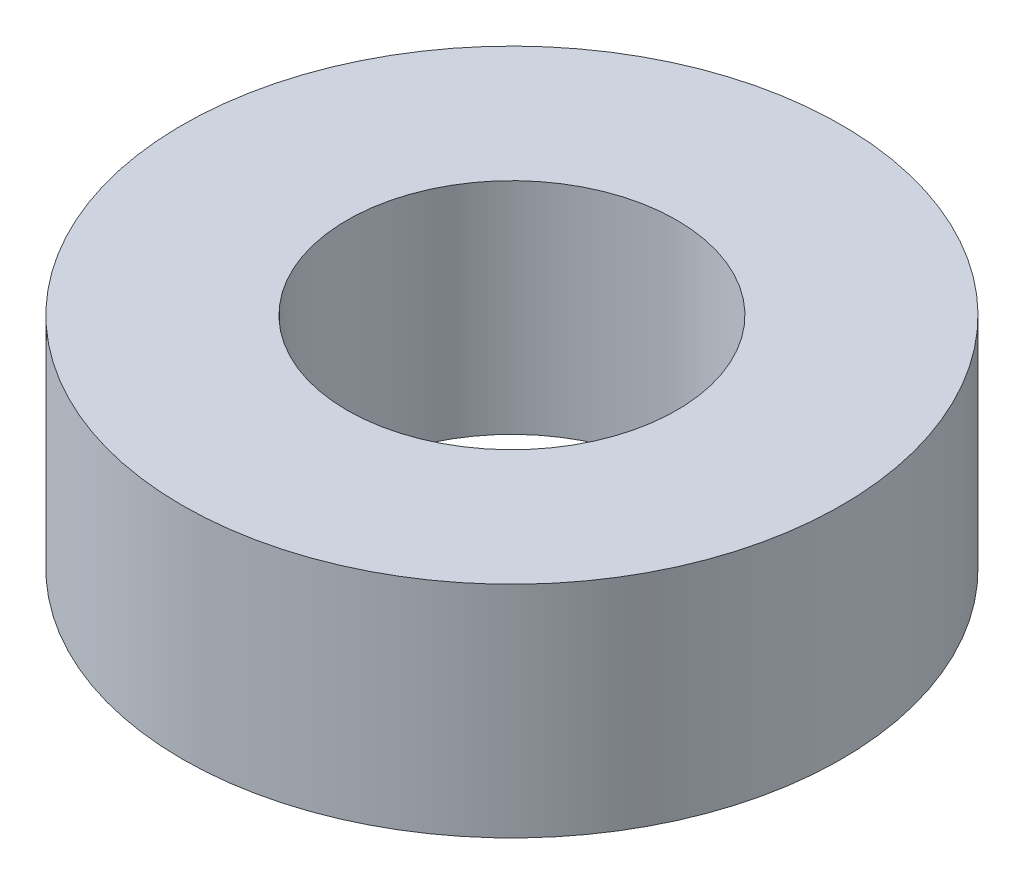
ISO-10303-21;
HEADER;
FILE_DESCRIPTION(('STEP AP214'),'2;1');
FILE_NAME('part.step','',(''),(''),'','','');
FILE_SCHEMA(('AUTOMOTIVE_DESIGN { 1 0 10303 214 1 1 1 1 }'));
ENDSEC;
DATA;
#1=APPLICATION_CONTEXT('core data for automotive mechanical design processes');
#2=APPLICATION_PROTOCOL_DEFINITION('international standard','automotive_design',2000,#1);
#3=PRODUCT_CONTEXT('',#1,'mechanical');
#4=PRODUCT('Part','Part','',(#3));
#5=PRODUCT_RELATED_PRODUCT_CATEGORY('part','',(#4));
#6=PRODUCT_DEFINITION_FORMATION('','',#4);
#7=PRODUCT_DEFINITION_CONTEXT('part definition',#1,'design');
#8=PRODUCT_DEFINITION('design','',#6,#7);
#9=PRODUCT_DEFINITION_SHAPE('','',#8);
#10=(LENGTH_UNIT() NAMED_UNIT(*) SI_UNIT(.MILLI.,.METRE.));
#11=(NAMED_UNIT(*) PLANE_ANGLE_UNIT() SI_UNIT($,.RADIAN.));
#12=(NAMED_UNIT(*) SI_UNIT($,.STERADIAN.) SOLID_ANGLE_UNIT());
#13=UNCERTAINTY_MEASURE_WITH_UNIT(LENGTH_MEASURE(1.E-05),#10,'distance_accuracy_value','');
#14=(GEOMETRIC_REPRESENTATION_CONTEXT(3) GLOBAL_UNCERTAINTY_ASSIGNED_CONTEXT((#13)) GLOBAL_UNIT_ASSIGNED_CONTEXT((#10,
#11,#12)) REPRESENTATION_CONTEXT('',''));
#15=CARTESIAN_POINT('',(0.,0.,0.));
#16=DIRECTION('',(0.,0.,1.));
#17=DIRECTION('',(1.,0.,0.));
#18=AXIS2_PLACEMENT_3D('',#15,#16,#17);
#19=CARTESIAN_POINT('',(0.,20.,0.));
#20=DIRECTION('',(0.,-1.,0.));
#21=DIRECTION('',(0.,0.,-1.));
#22=AXIS2_PLACEMENT_3D('',#19,#20,#21);
#23=CYLINDRICAL_SURFACE('',#22,30.);
#24=CARTESIAN_POINT('',(0.,20.,0.));
#25=DIRECTION('',(0.,1.,0.));
#26=DIRECTION('',(0.,0.,1.));
#27=AXIS2_PLACEMENT_3D('',#24,#25,#26);
#28=CIRCLE('',#27,30.);
#29=CARTESIAN_POINT('',(0.,20.,30.));
#30=VERTEX_POINT('',#29);
#31=EDGE_CURVE('E10',#30,#30,#28,.T.);
#32=ORIENTED_EDGE('',*,*,#31,.F.);
#33=EDGE_LOOP('',(#32));
#34=FACE_BOUND('',#33,.T.);
#35=CARTESIAN_POINT('',(0.,0.,0.));
#36=DIRECTION('',(0.,1.,0.));
#37=DIRECTION('',(0.,0.,1.));
#38=AXIS2_PLACEMENT_3D('',#35,#36,#37);
#39=CIRCLE('',#38,30.);
#40=CARTESIAN_POINT('',(0.,0.,30.));
#41=VERTEX_POINT('',#40);
#42=EDGE_CURVE('E36',#41,#41,#39,.T.);
#43=ORIENTED_EDGE('',*,*,#42,.T.);
#44=EDGE_LOOP('',(#43));
#45=FACE_BOUND('',#44,.T.);
#46=ADVANCED_FACE('F33',(#34,#45),#23,.T.);
#47=CARTESIAN_POINT('',(0.,20.,0.));
#48=DIRECTION('',(0.,1.,0.));
#49=DIRECTION('',(0.,0.,1.));
#50=AXIS2_PLACEMENT_3D('',#47,#48,#49);
#51=PLANE('',#50);
#52=CARTESIAN_POINT('',(0.,20.,0.));
#53=DIRECTION('',(0.,1.,0.));
#54=DIRECTION('',(0.,0.,1.));
#55=AXIS2_PLACEMENT_3D('',#52,#53,#54);
#56=CIRCLE('',#55,15.);
#57=CARTESIAN_POINT('',(0.,20.,15.));
#58=VERTEX_POINT('',#57);
#59=EDGE_CURVE('E45',#58,#58,#56,.T.);
#60=ORIENTED_EDGE('',*,*,#59,.F.);
#61=EDGE_LOOP('',(#60));
#62=FACE_BOUND('',#61,.T.);
#63=ORIENTED_EDGE('',*,*,#31,.T.);
#64=EDGE_LOOP('',(#63));
#65=FACE_BOUND('',#64,.T.);
#66=ADVANCED_FACE('F60',(#62,#65),#51,.T.);
#67=CARTESIAN_POINT('',(0.,0.,0.));
#68=DIRECTION('',(0.,1.,0.));
#69=DIRECTION('',(0.,0.,1.));
#70=AXIS2_PLACEMENT_3D('',#67,#68,#69);
#71=PLANE('',#70);
#72=CARTESIAN_POINT('',(0.,0.,0.));
#73=DIRECTION('',(0.,1.,0.));
#74=DIRECTION('',(0.,0.,1.));
#75=AXIS2_PLACEMENT_3D('',#72,#73,#74);
#76=CIRCLE('',#75,15.);
#77=CARTESIAN_POINT('',(0.,0.,15.));
#78=VERTEX_POINT('',#77);
#79=EDGE_CURVE('E43',#78,#78,#76,.T.);
#80=ORIENTED_EDGE('',*,*,#79,.T.);
#81=EDGE_LOOP('',(#80));
#82=FACE_BOUND('',#81,.T.);
#83=ORIENTED_EDGE('',*,*,#42,.F.);
#84=EDGE_LOOP('',(#83));
#85=FACE_BOUND('',#84,.T.);
#86=ADVANCED_FACE('F51',(#82,#85),#71,.F.);
#87=CARTESIAN_POINT('',(0.,0.,0.));
#88=DIRECTION('',(0.,1.,0.));
#89=DIRECTION('',(0.,0.,1.));
#90=AXIS2_PLACEMENT_3D('',#87,#88,#89);
#91=CYLINDRICAL_SURFACE('',#90,15.);
#92=ORIENTED_EDGE('',*,*,#79,.F.);
#93=EDGE_LOOP('',(#92));
#94=FACE_BOUND('',#93,.T.);
#95=ORIENTED_EDGE('',*,*,#59,.T.);
#96=EDGE_LOOP('',(#95));
#97=FACE_BOUND('',#96,.T.);
#98=ADVANCED_FACE('F54',(#94,#97),#91,.F.);
#99=CLOSED_SHELL('',(#46,#66,#86,#98));
#100=MANIFOLD_SOLID_BREP('B2',#99);
#101=ADVANCED_BREP_SHAPE_REPRESENTATION('',(#18,#100),#14);
#102=SHAPE_DEFINITION_REPRESENTATION(#9,#101);
ENDSEC;
END-ISO-10303-21;
